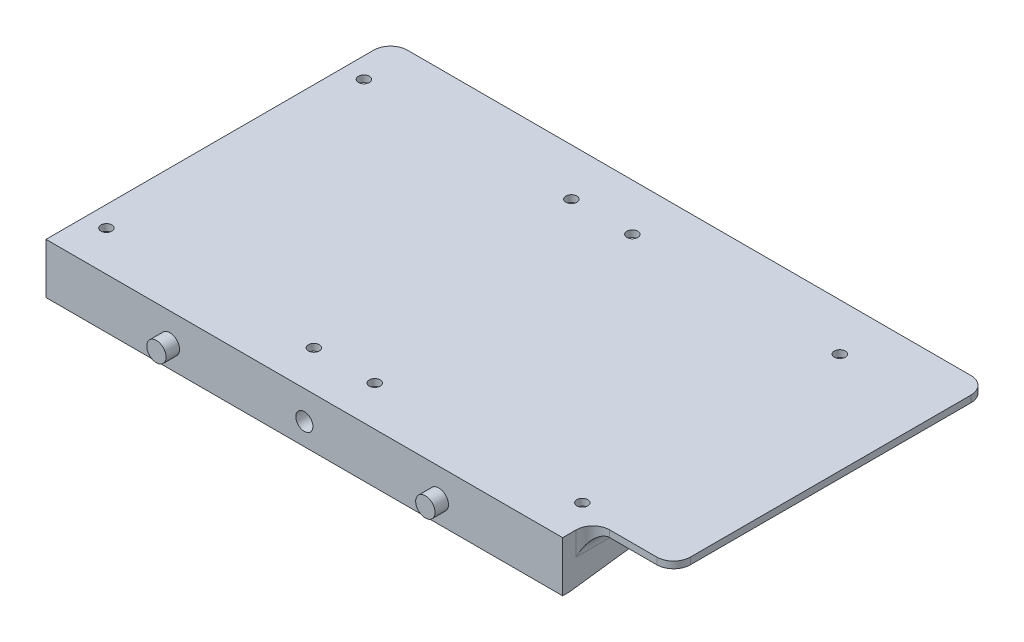
ISO-10303-21;
HEADER;
FILE_DESCRIPTION(('STEP AP214'),'2;1');
FILE_NAME('part.step','',(''),(''),'','','');
FILE_SCHEMA(('AUTOMOTIVE_DESIGN { 1 0 10303 214 1 1 1 1 }'));
ENDSEC;
DATA;
#1=APPLICATION_CONTEXT('core data for automotive mechanical design processes');
#2=APPLICATION_PROTOCOL_DEFINITION('international standard','automotive_design',2000,#1);
#3=PRODUCT_CONTEXT('',#1,'mechanical');
#4=PRODUCT('Part','Part','',(#3));
#5=PRODUCT_RELATED_PRODUCT_CATEGORY('part','',(#4));
#6=PRODUCT_DEFINITION_FORMATION('','',#4);
#7=PRODUCT_DEFINITION_CONTEXT('part definition',#1,'design');
#8=PRODUCT_DEFINITION('design','',#6,#7);
#9=PRODUCT_DEFINITION_SHAPE('','',#8);
#10=(LENGTH_UNIT() NAMED_UNIT(*) SI_UNIT(.MILLI.,.METRE.));
#11=(NAMED_UNIT(*) PLANE_ANGLE_UNIT() SI_UNIT($,.RADIAN.));
#12=(NAMED_UNIT(*) SI_UNIT($,.STERADIAN.) SOLID_ANGLE_UNIT());
#13=UNCERTAINTY_MEASURE_WITH_UNIT(LENGTH_MEASURE(1.E-05),#10,'distance_accuracy_value','');
#14=(GEOMETRIC_REPRESENTATION_CONTEXT(3) GLOBAL_UNCERTAINTY_ASSIGNED_CONTEXT((#13)) GLOBAL_UNIT_ASSIGNED_CONTEXT((#10,
#11,#12)) REPRESENTATION_CONTEXT('',''));
#15=CARTESIAN_POINT('',(0.,0.,0.));
#16=DIRECTION('',(0.,0.,1.));
#17=DIRECTION('',(1.,0.,0.));
#18=AXIS2_PLACEMENT_3D('',#15,#16,#17);
#19=CARTESIAN_POINT('',(151.7,0.,0.));
#20=DIRECTION('',(1.,0.,0.));
#21=DIRECTION('',(0.,0.,-1.));
#22=AXIS2_PLACEMENT_3D('',#19,#20,#21);
#23=PLANE('',#22);
#24=DIRECTION('',(0.,0.128284441850094,-0.991737415841113));
#25=VECTOR('',#24,1.);
#26=CARTESIAN_POINT('',(151.7,0.,-100.5));
#27=LINE('',#26,#25);
#28=CARTESIAN_POINT('',(151.7,-13.,0.));
#29=VERTEX_POINT('',#28);
#30=CARTESIAN_POINT('',(151.7,-5.,-61.8461538461539));
#31=VERTEX_POINT('',#30);
#32=EDGE_CURVE('E320',#29,#31,#27,.T.);
#33=ORIENTED_EDGE('',*,*,#32,.T.);
#34=DIRECTION('',(0.,0.,1.));
#35=VECTOR('',#34,1.);
#36=CARTESIAN_POINT('',(151.7,-5.,0.));
#37=LINE('',#36,#35);
#38=CARTESIAN_POINT('',(151.7,-5.,-1.99999999999999));
#39=VERTEX_POINT('',#38);
#40=EDGE_CURVE('E292',#31,#39,#37,.T.);
#41=ORIENTED_EDGE('',*,*,#40,.T.);
#42=DIRECTION('',(0.,1.,0.));
#43=VECTOR('',#42,1.);
#44=CARTESIAN_POINT('',(151.7,2.,-1.99999999999999));
#45=LINE('',#44,#43);
#46=CARTESIAN_POINT('',(151.7,2.,-1.99999999999999));
#47=VERTEX_POINT('',#46);
#48=EDGE_CURVE('E59',#39,#47,#45,.T.);
#49=ORIENTED_EDGE('',*,*,#48,.T.);
#50=DIRECTION('',(0.,0.,1.));
#51=VECTOR('',#50,1.);
#52=CARTESIAN_POINT('',(151.7,2.,0.));
#53=LINE('',#52,#51);
#54=CARTESIAN_POINT('',(151.7,2.,2.));
#55=VERTEX_POINT('',#54);
#56=EDGE_CURVE('E325',#47,#55,#53,.T.);
#57=ORIENTED_EDGE('',*,*,#56,.T.);
#58=DIRECTION('',(0.,-1.,0.));
#59=VECTOR('',#58,1.);
#60=CARTESIAN_POINT('',(151.7,0.,2.));
#61=LINE('',#60,#59);
#62=CARTESIAN_POINT('',(151.7,-13.,2.));
#63=VERTEX_POINT('',#62);
#64=EDGE_CURVE('E172',#55,#63,#61,.T.);
#65=ORIENTED_EDGE('',*,*,#64,.T.);
#66=DIRECTION('',(0.,0.,1.));
#67=VECTOR('',#66,1.);
#68=CARTESIAN_POINT('',(151.7,-13.,2.));
#69=LINE('',#68,#67);
#70=EDGE_CURVE('E324',#29,#63,#69,.T.);
#71=ORIENTED_EDGE('',*,*,#70,.F.);
#72=EDGE_LOOP('',(#33,#41,#49,#57,#65,#71));
#73=FACE_BOUND('',#72,.T.);
#74=ADVANCED_FACE('F37',(#73),#23,.T.);
#75=CARTESIAN_POINT('',(0.,0.,0.));
#76=DIRECTION('',(0.,0.,1.));
#77=DIRECTION('',(1.,0.,0.));
#78=AXIS2_PLACEMENT_3D('',#75,#76,#77);
#79=PLANE('',#78);
#80=DIRECTION('',(0.,-1.,0.));
#81=VECTOR('',#80,1.);
#82=CARTESIAN_POINT('',(149.7,-13.,0.));
#83=LINE('',#82,#81);
#84=CARTESIAN_POINT('',(149.7,0.,0.));
#85=VERTEX_POINT('',#84);
#86=CARTESIAN_POINT('',(149.7,-13.,0.));
#87=VERTEX_POINT('',#86);
#88=EDGE_CURVE('E252',#85,#87,#83,.T.);
#89=ORIENTED_EDGE('',*,*,#88,.T.);
#90=DIRECTION('',(1.,0.,0.));
#91=VECTOR('',#90,1.);
#92=CARTESIAN_POINT('',(0.,-13.,0.));
#93=LINE('',#92,#91);
#94=CARTESIAN_POINT('',(0.,-13.,0.));
#95=VERTEX_POINT('',#94);
#96=EDGE_CURVE('E178',#95,#87,#93,.T.);
#97=ORIENTED_EDGE('',*,*,#96,.F.);
#98=DIRECTION('',(0.,1.,0.));
#99=VECTOR('',#98,1.);
#100=CARTESIAN_POINT('',(0.,0.,0.));
#101=LINE('',#100,#99);
#102=CARTESIAN_POINT('',(0.,0.,0.));
#103=VERTEX_POINT('',#102);
#104=EDGE_CURVE('E338',#95,#103,#101,.T.);
#105=ORIENTED_EDGE('',*,*,#104,.T.);
#106=DIRECTION('',(1.,0.,0.));
#107=VECTOR('',#106,1.);
#108=CARTESIAN_POINT('',(0.,0.,0.));
#109=LINE('',#108,#107);
#110=EDGE_CURVE('E232',#103,#85,#109,.T.);
#111=ORIENTED_EDGE('',*,*,#110,.T.);
#112=EDGE_LOOP('',(#89,#97,#105,#111));
#113=FACE_BOUND('',#112,.T.);
#114=CARTESIAN_POINT('',(74.85,-6.5,0.));
#115=DIRECTION('',(0.,0.,1.));
#116=DIRECTION('',(1.,0.,0.));
#117=AXIS2_PLACEMENT_3D('',#114,#115,#116);
#118=CIRCLE('',#117,4.00000000000001);
#119=CARTESIAN_POINT('',(78.85,-6.5,0.));
#120=VERTEX_POINT('',#119);
#121=EDGE_CURVE('E215',#120,#120,#118,.F.);
#122=ORIENTED_EDGE('',*,*,#121,.F.);
#123=EDGE_LOOP('',(#122));
#124=FACE_BOUND('',#123,.T.);
#125=ADVANCED_FACE('F344',(#113,#124),#79,.F.);
#126=CARTESIAN_POINT('',(0.,2.,-100.5));
#127=DIRECTION('',(0.,0.,-1.));
#128=DIRECTION('',(-1.,0.,0.));
#129=AXIS2_PLACEMENT_3D('',#126,#127,#128);
#130=PLANE('',#129);
#131=DIRECTION('',(1.,0.,0.));
#132=VECTOR('',#131,1.);
#133=CARTESIAN_POINT('',(0.,0.,-100.5));
#134=LINE('',#133,#132);
#135=CARTESIAN_POINT('',(3.,0.,-100.5));
#136=VERTEX_POINT('',#135);
#137=CARTESIAN_POINT('',(149.7,0.,-100.5));
#138=VERTEX_POINT('',#137);
#139=EDGE_CURVE('E227',#136,#138,#134,.T.);
#140=ORIENTED_EDGE('',*,*,#139,.F.);
#141=DIRECTION('',(0.,-1.,0.));
#142=VECTOR('',#141,1.);
#143=CARTESIAN_POINT('',(3.,2.,-100.5));
#144=LINE('',#143,#142);
#145=CARTESIAN_POINT('',(3.,2.,-100.5));
#146=VERTEX_POINT('',#145);
#147=EDGE_CURVE('E288',#136,#146,#144,.F.);
#148=ORIENTED_EDGE('',*,*,#147,.T.);
#149=DIRECTION('',(1.,0.,0.));
#150=VECTOR('',#149,1.);
#151=CARTESIAN_POINT('',(0.,2.,-100.5));
#152=LINE('',#151,#150);
#153=CARTESIAN_POINT('',(170.7,2.,-100.5));
#154=VERTEX_POINT('',#153);
#155=EDGE_CURVE('E200',#146,#154,#152,.T.);
#156=ORIENTED_EDGE('',*,*,#155,.T.);
#157=DIRECTION('',(0.,1.,0.));
#158=VECTOR('',#157,1.);
#159=CARTESIAN_POINT('',(170.7,2.,-100.5));
#160=LINE('',#159,#158);
#161=CARTESIAN_POINT('',(170.7,0.,-100.5));
#162=VERTEX_POINT('',#161);
#163=EDGE_CURVE('E285',#154,#162,#160,.F.);
#164=ORIENTED_EDGE('',*,*,#163,.T.);
#165=DIRECTION('',(1.,0.,0.));
#166=VECTOR('',#165,1.);
#167=CARTESIAN_POINT('',(0.,0.,-100.5));
#168=LINE('',#167,#166);
#169=CARTESIAN_POINT('',(156.7,0.,-100.5));
#170=VERTEX_POINT('',#169);
#171=EDGE_CURVE('E362',#170,#162,#168,.T.);
#172=ORIENTED_EDGE('',*,*,#171,.F.);
#173=DIRECTION('',(-1.,0.,0.));
#174=VECTOR('',#173,1.);
#175=CARTESIAN_POINT('',(151.7,0.,-100.5));
#176=LINE('',#175,#174);
#177=EDGE_CURVE('E51',#170,#138,#176,.T.);
#178=ORIENTED_EDGE('',*,*,#177,.T.);
#179=EDGE_LOOP('',(#140,#148,#156,#164,#172,#178));
#180=FACE_BOUND('',#179,.T.);
#181=ADVANCED_FACE('F361',(#180),#130,.T.);
#182=CARTESIAN_POINT('',(83.92,2.,-9.90000000000002));
#183=DIRECTION('',(0.,-1.,0.));
#184=DIRECTION('',(0.,0.,-1.));
#185=AXIS2_PLACEMENT_3D('',#182,#183,#184);
#186=CYLINDRICAL_SURFACE('',#185,1.62499999999999);
#187=CARTESIAN_POINT('',(83.92,2.,-9.90000000000002));
#188=DIRECTION('',(0.,1.,0.));
#189=DIRECTION('',(0.,0.,1.));
#190=AXIS2_PLACEMENT_3D('',#187,#188,#189);
#191=CIRCLE('',#190,1.62499999999999);
#192=CARTESIAN_POINT('',(83.92,2.,-8.27500000000003));
#193=VERTEX_POINT('',#192);
#194=EDGE_CURVE('E209',#193,#193,#191,.T.);
#195=ORIENTED_EDGE('',*,*,#194,.T.);
#196=EDGE_LOOP('',(#195));
#197=FACE_BOUND('',#196,.T.);
#198=CARTESIAN_POINT('',(83.92,0.,-9.90000000000002));
#199=DIRECTION('',(0.,1.,0.));
#200=DIRECTION('',(0.,0.,1.));
#201=AXIS2_PLACEMENT_3D('',#198,#199,#200);
#202=CIRCLE('',#201,1.62499999999999);
#203=CARTESIAN_POINT('',(83.92,0.,-8.27500000000003));
#204=VERTEX_POINT('',#203);
#205=EDGE_CURVE('E244',#204,#204,#202,.T.);
#206=ORIENTED_EDGE('',*,*,#205,.F.);
#207=EDGE_LOOP('',(#206));
#208=FACE_BOUND('',#207,.T.);
#209=ADVANCED_FACE('F405',(#197,#208),#186,.F.);
#210=CARTESIAN_POINT('',(83.92,2.,-86.5));
#211=DIRECTION('',(0.,-1.,0.));
#212=DIRECTION('',(0.,0.,-1.));
#213=AXIS2_PLACEMENT_3D('',#210,#211,#212);
#214=CYLINDRICAL_SURFACE('',#213,1.62499999999999);
#215=CARTESIAN_POINT('',(83.92,2.,-86.5));
#216=DIRECTION('',(0.,1.,0.));
#217=DIRECTION('',(0.,0.,1.));
#218=AXIS2_PLACEMENT_3D('',#215,#216,#217);
#219=CIRCLE('',#218,1.62499999999999);
#220=CARTESIAN_POINT('',(83.92,2.,-84.875));
#221=VERTEX_POINT('',#220);
#222=EDGE_CURVE('E206',#221,#221,#219,.T.);
#223=ORIENTED_EDGE('',*,*,#222,.T.);
#224=EDGE_LOOP('',(#223));
#225=FACE_BOUND('',#224,.T.);
#226=CARTESIAN_POINT('',(83.92,0.,-86.5));
#227=DIRECTION('',(0.,1.,0.));
#228=DIRECTION('',(0.,0.,1.));
#229=AXIS2_PLACEMENT_3D('',#226,#227,#228);
#230=CIRCLE('',#229,1.62499999999999);
#231=CARTESIAN_POINT('',(83.92,0.,-84.875));
#232=VERTEX_POINT('',#231);
#233=EDGE_CURVE('E241',#232,#232,#230,.T.);
#234=ORIENTED_EDGE('',*,*,#233,.F.);
#235=EDGE_LOOP('',(#234));
#236=FACE_BOUND('',#235,.T.);
#237=ADVANCED_FACE('F427',(#225,#236),#214,.F.);
#238=CARTESIAN_POINT('',(145.64,2.,-86.5));
#239=DIRECTION('',(0.,-1.,0.));
#240=DIRECTION('',(0.,0.,-1.));
#241=AXIS2_PLACEMENT_3D('',#238,#239,#240);
#242=CYLINDRICAL_SURFACE('',#241,1.62499999999998);
#243=CARTESIAN_POINT('',(145.64,2.,-86.5));
#244=DIRECTION('',(0.,1.,0.));
#245=DIRECTION('',(0.,0.,1.));
#246=AXIS2_PLACEMENT_3D('',#243,#244,#245);
#247=CIRCLE('',#246,1.62499999999998);
#248=CARTESIAN_POINT('',(145.64,2.,-84.875));
#249=VERTEX_POINT('',#248);
#250=EDGE_CURVE('E203',#249,#249,#247,.T.);
#251=ORIENTED_EDGE('',*,*,#250,.T.);
#252=EDGE_LOOP('',(#251));
#253=FACE_BOUND('',#252,.T.);
#254=CARTESIAN_POINT('',(145.64,0.,-86.5));
#255=DIRECTION('',(0.,1.,0.));
#256=DIRECTION('',(0.,0.,1.));
#257=AXIS2_PLACEMENT_3D('',#254,#255,#256);
#258=CIRCLE('',#257,1.62499999999998);
#259=CARTESIAN_POINT('',(145.64,0.,-84.875));
#260=VERTEX_POINT('',#259);
#261=EDGE_CURVE('E238',#260,#260,#258,.T.);
#262=ORIENTED_EDGE('',*,*,#261,.F.);
#263=EDGE_LOOP('',(#262));
#264=FACE_BOUND('',#263,.T.);
#265=ADVANCED_FACE('F431',(#253,#264),#242,.F.);
#266=CARTESIAN_POINT('',(4.07,2.,-86.5));
#267=DIRECTION('',(0.,-1.,0.));
#268=DIRECTION('',(0.,0.,-1.));
#269=AXIS2_PLACEMENT_3D('',#266,#267,#268);
#270=CYLINDRICAL_SURFACE('',#269,1.625);
#271=CARTESIAN_POINT('',(4.07,2.,-86.5));
#272=DIRECTION('',(0.,1.,0.));
#273=DIRECTION('',(0.,0.,1.));
#274=AXIS2_PLACEMENT_3D('',#271,#272,#273);
#275=CIRCLE('',#274,1.625);
#276=CARTESIAN_POINT('',(4.07,2.,-84.875));
#277=VERTEX_POINT('',#276);
#278=EDGE_CURVE('E197',#277,#277,#275,.T.);
#279=ORIENTED_EDGE('',*,*,#278,.T.);
#280=EDGE_LOOP('',(#279));
#281=FACE_BOUND('',#280,.T.);
#282=CARTESIAN_POINT('',(4.07,0.,-86.5));
#283=DIRECTION('',(0.,1.,0.));
#284=DIRECTION('',(0.,0.,1.));
#285=AXIS2_PLACEMENT_3D('',#282,#283,#284);
#286=CIRCLE('',#285,1.625);
#287=CARTESIAN_POINT('',(4.07,0.,-84.875));
#288=VERTEX_POINT('',#287);
#289=EDGE_CURVE('E224',#288,#288,#286,.T.);
#290=ORIENTED_EDGE('',*,*,#289,.F.);
#291=EDGE_LOOP('',(#290));
#292=FACE_BOUND('',#291,.T.);
#293=ADVANCED_FACE('F434',(#281,#292),#270,.F.);
#294=CARTESIAN_POINT('',(65.79,2.,-86.5));
#295=DIRECTION('',(0.,-1.,0.));
#296=DIRECTION('',(0.,0.,-1.));
#297=AXIS2_PLACEMENT_3D('',#294,#295,#296);
#298=CYLINDRICAL_SURFACE('',#297,1.62499999999999);
#299=CARTESIAN_POINT('',(65.79,2.,-86.5));
#300=DIRECTION('',(0.,1.,0.));
#301=DIRECTION('',(0.,0.,1.));
#302=AXIS2_PLACEMENT_3D('',#299,#300,#301);
#303=CIRCLE('',#302,1.62499999999999);
#304=CARTESIAN_POINT('',(65.79,2.,-84.875));
#305=VERTEX_POINT('',#304);
#306=EDGE_CURVE('E194',#305,#305,#303,.T.);
#307=ORIENTED_EDGE('',*,*,#306,.T.);
#308=EDGE_LOOP('',(#307));
#309=FACE_BOUND('',#308,.T.);
#310=CARTESIAN_POINT('',(65.79,0.,-86.5));
#311=DIRECTION('',(0.,1.,0.));
#312=DIRECTION('',(0.,0.,1.));
#313=AXIS2_PLACEMENT_3D('',#310,#311,#312);
#314=CIRCLE('',#313,1.62499999999999);
#315=CARTESIAN_POINT('',(65.79,0.,-84.875));
#316=VERTEX_POINT('',#315);
#317=EDGE_CURVE('E221',#316,#316,#314,.T.);
#318=ORIENTED_EDGE('',*,*,#317,.F.);
#319=EDGE_LOOP('',(#318));
#320=FACE_BOUND('',#319,.T.);
#321=ADVANCED_FACE('F439',(#309,#320),#298,.F.);
#322=CARTESIAN_POINT('',(4.07,2.,-9.90000000000002));
#323=DIRECTION('',(0.,-1.,0.));
#324=DIRECTION('',(0.,0.,-1.));
#325=AXIS2_PLACEMENT_3D('',#322,#323,#324);
#326=CYLINDRICAL_SURFACE('',#325,1.625);
#327=CARTESIAN_POINT('',(4.07,2.,-9.90000000000002));
#328=DIRECTION('',(0.,1.,0.));
#329=DIRECTION('',(0.,0.,1.));
#330=AXIS2_PLACEMENT_3D('',#327,#328,#329);
#331=CIRCLE('',#330,1.625);
#332=CARTESIAN_POINT('',(4.07,2.,-8.27500000000002));
#333=VERTEX_POINT('',#332);
#334=EDGE_CURVE('E190',#333,#333,#331,.T.);
#335=ORIENTED_EDGE('',*,*,#334,.T.);
#336=EDGE_LOOP('',(#335));
#337=FACE_BOUND('',#336,.T.);
#338=CARTESIAN_POINT('',(4.07,0.,-9.90000000000002));
#339=DIRECTION('',(0.,1.,0.));
#340=DIRECTION('',(0.,0.,1.));
#341=AXIS2_PLACEMENT_3D('',#338,#339,#340);
#342=CIRCLE('',#341,1.625);
#343=CARTESIAN_POINT('',(4.07,0.,-8.27500000000002));
#344=VERTEX_POINT('',#343);
#345=EDGE_CURVE('E218',#344,#344,#342,.T.);
#346=ORIENTED_EDGE('',*,*,#345,.F.);
#347=EDGE_LOOP('',(#346));
#348=FACE_BOUND('',#347,.T.);
#349=ADVANCED_FACE('F443',(#337,#348),#326,.F.);
#350=CARTESIAN_POINT('',(65.79,2.,-9.90000000000002));
#351=DIRECTION('',(0.,-1.,0.));
#352=DIRECTION('',(0.,0.,-1.));
#353=AXIS2_PLACEMENT_3D('',#350,#351,#352);
#354=CYLINDRICAL_SURFACE('',#353,1.625);
#355=CARTESIAN_POINT('',(65.79,2.,-9.90000000000002));
#356=DIRECTION('',(0.,1.,0.));
#357=DIRECTION('',(0.,0.,1.));
#358=AXIS2_PLACEMENT_3D('',#355,#356,#357);
#359=CIRCLE('',#358,1.625);
#360=CARTESIAN_POINT('',(65.79,2.,-8.27500000000002));
#361=VERTEX_POINT('',#360);
#362=EDGE_CURVE('E187',#361,#361,#359,.T.);
#363=ORIENTED_EDGE('',*,*,#362,.T.);
#364=EDGE_LOOP('',(#363));
#365=FACE_BOUND('',#364,.T.);
#366=CARTESIAN_POINT('',(65.79,0.,-9.90000000000002));
#367=DIRECTION('',(0.,1.,0.));
#368=DIRECTION('',(0.,0.,1.));
#369=AXIS2_PLACEMENT_3D('',#366,#367,#368);
#370=CIRCLE('',#369,1.625);
#371=CARTESIAN_POINT('',(65.79,0.,-8.27500000000002));
#372=VERTEX_POINT('',#371);
#373=EDGE_CURVE('E180',#372,#372,#370,.T.);
#374=ORIENTED_EDGE('',*,*,#373,.F.);
#375=EDGE_LOOP('',(#374));
#376=FACE_BOUND('',#375,.T.);
#377=ADVANCED_FACE('F423',(#365,#376),#354,.F.);
#378=CARTESIAN_POINT('',(145.64,2.,-9.90000000000002));
#379=DIRECTION('',(0.,-1.,0.));
#380=DIRECTION('',(0.,0.,-1.));
#381=AXIS2_PLACEMENT_3D('',#378,#379,#380);
#382=CYLINDRICAL_SURFACE('',#381,1.625);
#383=CARTESIAN_POINT('',(145.64,2.,-9.90000000000002));
#384=DIRECTION('',(0.,1.,0.));
#385=DIRECTION('',(0.,0.,1.));
#386=AXIS2_PLACEMENT_3D('',#383,#384,#385);
#387=CIRCLE('',#386,1.625);
#388=CARTESIAN_POINT('',(145.64,2.,-8.27500000000002));
#389=VERTEX_POINT('',#388);
#390=EDGE_CURVE('E212',#389,#389,#387,.T.);
#391=ORIENTED_EDGE('',*,*,#390,.T.);
#392=EDGE_LOOP('',(#391));
#393=FACE_BOUND('',#392,.T.);
#394=CARTESIAN_POINT('',(145.64,0.,-9.90000000000002));
#395=DIRECTION('',(0.,1.,0.));
#396=DIRECTION('',(0.,0.,1.));
#397=AXIS2_PLACEMENT_3D('',#394,#395,#396);
#398=CIRCLE('',#397,1.625);
#399=CARTESIAN_POINT('',(145.64,0.,-8.27500000000002));
#400=VERTEX_POINT('',#399);
#401=EDGE_CURVE('E191',#400,#400,#398,.T.);
#402=ORIENTED_EDGE('',*,*,#401,.F.);
#403=EDGE_LOOP('',(#402));
#404=FACE_BOUND('',#403,.T.);
#405=ADVANCED_FACE('F417',(#393,#404),#382,.F.);
#406=CARTESIAN_POINT('',(0.,2.,0.));
#407=DIRECTION('',(0.,1.,0.));
#408=DIRECTION('',(0.,0.,1.));
#409=AXIS2_PLACEMENT_3D('',#406,#407,#408);
#410=PLANE('',#409);
#411=DIRECTION('',(1.,0.,0.));
#412=VECTOR('',#411,1.);
#413=CARTESIAN_POINT('',(0.,2.,-6.99999999999999));
#414=LINE('',#413,#412);
#415=CARTESIAN_POINT('',(156.7,2.,-6.99999999999999));
#416=VERTEX_POINT('',#415);
#417=CARTESIAN_POINT('',(170.7,2.,-6.99999999999999));
#418=VERTEX_POINT('',#417);
#419=EDGE_CURVE('E308',#416,#418,#414,.T.);
#420=ORIENTED_EDGE('',*,*,#419,.T.);
#421=CARTESIAN_POINT('',(170.7,2.,-12.));
#422=DIRECTION('',(0.,1.,0.));
#423=DIRECTION('',(0.,0.,1.));
#424=AXIS2_PLACEMENT_3D('',#421,#422,#423);
#425=CIRCLE('',#424,5.);
#426=CARTESIAN_POINT('',(175.7,2.,-12.));
#427=VERTEX_POINT('',#426);
#428=EDGE_CURVE('E266',#418,#427,#425,.T.);
#429=ORIENTED_EDGE('',*,*,#428,.T.);
#430=DIRECTION('',(0.,0.,-1.));
#431=VECTOR('',#430,1.);
#432=CARTESIAN_POINT('',(175.7,2.,0.));
#433=LINE('',#432,#431);
#434=CARTESIAN_POINT('',(175.7,2.,-95.5));
#435=VERTEX_POINT('',#434);
#436=EDGE_CURVE('E471',#427,#435,#433,.T.);
#437=ORIENTED_EDGE('',*,*,#436,.T.);
#438=CARTESIAN_POINT('',(170.7,2.,-95.5));
#439=DIRECTION('',(0.,1.,0.));
#440=DIRECTION('',(0.,0.,1.));
#441=AXIS2_PLACEMENT_3D('',#438,#439,#440);
#442=CIRCLE('',#441,5.);
#443=EDGE_CURVE('E263',#435,#154,#442,.T.);
#444=ORIENTED_EDGE('',*,*,#443,.T.);
#445=ORIENTED_EDGE('',*,*,#155,.F.);
#446=CARTESIAN_POINT('',(3.,2.,-95.5));
#447=DIRECTION('',(0.,1.,0.));
#448=DIRECTION('',(0.,0.,1.));
#449=AXIS2_PLACEMENT_3D('',#446,#447,#448);
#450=CIRCLE('',#449,5.);
#451=CARTESIAN_POINT('',(-2.,2.,-95.5));
#452=VERTEX_POINT('',#451);
#453=EDGE_CURVE('E157',#146,#452,#450,.T.);
#454=ORIENTED_EDGE('',*,*,#453,.T.);
#455=DIRECTION('',(0.,0.,-1.));
#456=VECTOR('',#455,1.);
#457=CARTESIAN_POINT('',(-2.,2.,0.));
#458=LINE('',#457,#456);
#459=CARTESIAN_POINT('',(-2.,2.,2.));
#460=VERTEX_POINT('',#459);
#461=EDGE_CURVE('E147',#460,#452,#458,.T.);
#462=ORIENTED_EDGE('',*,*,#461,.F.);
#463=DIRECTION('',(1.,0.,0.));
#464=VECTOR('',#463,1.);
#465=CARTESIAN_POINT('',(0.,2.,2.));
#466=LINE('',#465,#464);
#467=EDGE_CURVE('E154',#460,#55,#466,.T.);
#468=ORIENTED_EDGE('',*,*,#467,.T.);
#469=ORIENTED_EDGE('',*,*,#56,.F.);
#470=CARTESIAN_POINT('',(156.7,2.,-1.99999999999999));
#471=DIRECTION('',(0.,1.,0.));
#472=DIRECTION('',(0.,0.,1.));
#473=AXIS2_PLACEMENT_3D('',#470,#471,#472);
#474=CIRCLE('',#473,5.);
#475=EDGE_CURVE('E290',#47,#416,#474,.F.);
#476=ORIENTED_EDGE('',*,*,#475,.T.);
#477=EDGE_LOOP('',(#420,#429,#437,#444,#445,#454,#462,#468,#469,#476));
#478=FACE_BOUND('',#477,.T.);
#479=ORIENTED_EDGE('',*,*,#362,.F.);
#480=EDGE_LOOP('',(#479));
#481=FACE_BOUND('',#480,.T.);
#482=ORIENTED_EDGE('',*,*,#334,.F.);
#483=EDGE_LOOP('',(#482));
#484=FACE_BOUND('',#483,.T.);
#485=ORIENTED_EDGE('',*,*,#306,.F.);
#486=EDGE_LOOP('',(#485));
#487=FACE_BOUND('',#486,.T.);
#488=ORIENTED_EDGE('',*,*,#278,.F.);
#489=EDGE_LOOP('',(#488));
#490=FACE_BOUND('',#489,.T.);
#491=ORIENTED_EDGE('',*,*,#250,.F.);
#492=EDGE_LOOP('',(#491));
#493=FACE_BOUND('',#492,.T.);
#494=ORIENTED_EDGE('',*,*,#222,.F.);
#495=EDGE_LOOP('',(#494));
#496=FACE_BOUND('',#495,.T.);
#497=ORIENTED_EDGE('',*,*,#194,.F.);
#498=EDGE_LOOP('',(#497));
#499=FACE_BOUND('',#498,.T.);
#500=ORIENTED_EDGE('',*,*,#390,.F.);
#501=EDGE_LOOP('',(#500));
#502=FACE_BOUND('',#501,.T.);
#503=ADVANCED_FACE('F150',(#478,#481,#484,#487,#490,#493,#496,#499,#502),#410,.T.);
#504=CARTESIAN_POINT('',(0.,0.,0.));
#505=DIRECTION('',(0.,1.,0.));
#506=DIRECTION('',(0.,0.,1.));
#507=AXIS2_PLACEMENT_3D('',#504,#505,#506);
#508=PLANE('',#507);
#509=ORIENTED_EDGE('',*,*,#373,.T.);
#510=EDGE_LOOP('',(#509));
#511=FACE_BOUND('',#510,.T.);
#512=ORIENTED_EDGE('',*,*,#345,.T.);
#513=EDGE_LOOP('',(#512));
#514=FACE_BOUND('',#513,.T.);
#515=ORIENTED_EDGE('',*,*,#317,.T.);
#516=EDGE_LOOP('',(#515));
#517=FACE_BOUND('',#516,.T.);
#518=ORIENTED_EDGE('',*,*,#289,.T.);
#519=EDGE_LOOP('',(#518));
#520=FACE_BOUND('',#519,.T.);
#521=DIRECTION('',(0.,0.,-1.));
#522=VECTOR('',#521,1.);
#523=CARTESIAN_POINT('',(0.,0.,0.));
#524=LINE('',#523,#522);
#525=CARTESIAN_POINT('',(0.,0.,-99.5));
#526=VERTEX_POINT('',#525);
#527=EDGE_CURVE('E229',#103,#526,#524,.T.);
#528=ORIENTED_EDGE('',*,*,#527,.T.);
#529=CARTESIAN_POINT('',(3.,0.,-95.5));
#530=DIRECTION('',(0.,1.,0.));
#531=DIRECTION('',(0.,0.,1.));
#532=AXIS2_PLACEMENT_3D('',#529,#530,#531);
#533=CIRCLE('',#532,5.);
#534=EDGE_CURVE('E283',#526,#136,#533,.F.);
#535=ORIENTED_EDGE('',*,*,#534,.T.);
#536=ORIENTED_EDGE('',*,*,#139,.T.);
#537=DIRECTION('',(0.,0.,-1.));
#538=VECTOR('',#537,1.);
#539=CARTESIAN_POINT('',(149.7,0.,0.));
#540=LINE('',#539,#538);
#541=EDGE_CURVE('E235',#85,#138,#540,.T.);
#542=ORIENTED_EDGE('',*,*,#541,.F.);
#543=ORIENTED_EDGE('',*,*,#110,.F.);
#544=EDGE_LOOP('',(#528,#535,#536,#542,#543));
#545=FACE_BOUND('',#544,.T.);
#546=ORIENTED_EDGE('',*,*,#261,.T.);
#547=EDGE_LOOP('',(#546));
#548=FACE_BOUND('',#547,.T.);
#549=ORIENTED_EDGE('',*,*,#233,.T.);
#550=EDGE_LOOP('',(#549));
#551=FACE_BOUND('',#550,.T.);
#552=ORIENTED_EDGE('',*,*,#205,.T.);
#553=EDGE_LOOP('',(#552));
#554=FACE_BOUND('',#553,.T.);
#555=ORIENTED_EDGE('',*,*,#401,.T.);
#556=EDGE_LOOP('',(#555));
#557=FACE_BOUND('',#556,.T.);
#558=ADVANCED_FACE('F351',(#511,#514,#517,#520,#545,#548,#551,#554,#557),#508,.F.);
#559=CARTESIAN_POINT('',(0.,-13.,2.));
#560=DIRECTION('',(0.,1.,0.));
#561=DIRECTION('',(0.,0.,1.));
#562=AXIS2_PLACEMENT_3D('',#559,#560,#561);
#563=PLANE('',#562);
#564=DIRECTION('',(-1.,0.,0.));
#565=VECTOR('',#564,1.);
#566=CARTESIAN_POINT('',(151.7,-13.,0.));
#567=LINE('',#566,#565);
#568=EDGE_CURVE('E327',#29,#87,#567,.T.);
#569=ORIENTED_EDGE('',*,*,#568,.F.);
#570=ORIENTED_EDGE('',*,*,#70,.T.);
#571=DIRECTION('',(1.,0.,0.));
#572=VECTOR('',#571,1.);
#573=CARTESIAN_POINT('',(0.,-13.,2.));
#574=LINE('',#573,#572);
#575=CARTESIAN_POINT('',(-2.,-13.,2.));
#576=VERTEX_POINT('',#575);
#577=EDGE_CURVE('E177',#576,#63,#574,.T.);
#578=ORIENTED_EDGE('',*,*,#577,.F.);
#579=DIRECTION('',(0.,0.,-1.));
#580=VECTOR('',#579,1.);
#581=CARTESIAN_POINT('',(-2.,-13.,2.));
#582=LINE('',#581,#580);
#583=CARTESIAN_POINT('',(-2.,-13.,0.));
#584=VERTEX_POINT('',#583);
#585=EDGE_CURVE('E168',#576,#584,#582,.T.);
#586=ORIENTED_EDGE('',*,*,#585,.T.);
#587=DIRECTION('',(1.,0.,0.));
#588=VECTOR('',#587,1.);
#589=CARTESIAN_POINT('',(-2.,-13.,0.));
#590=LINE('',#589,#588);
#591=EDGE_CURVE('E161',#584,#95,#590,.T.);
#592=ORIENTED_EDGE('',*,*,#591,.T.);
#593=ORIENTED_EDGE('',*,*,#96,.T.);
#594=EDGE_LOOP('',(#569,#570,#578,#586,#592,#593));
#595=FACE_BOUND('',#594,.T.);
#596=ADVANCED_FACE('F411',(#595),#563,.F.);
#597=CARTESIAN_POINT('',(0.,0.,2.));
#598=DIRECTION('',(0.,0.,1.));
#599=DIRECTION('',(1.,0.,0.));
#600=AXIS2_PLACEMENT_3D('',#597,#598,#599);
#601=PLANE('',#600);
#602=ORIENTED_EDGE('',*,*,#64,.F.);
#603=ORIENTED_EDGE('',*,*,#467,.F.);
#604=DIRECTION('',(0.,1.,0.));
#605=VECTOR('',#604,1.);
#606=CARTESIAN_POINT('',(-2.,0.,2.));
#607=LINE('',#606,#605);
#608=EDGE_CURVE('E165',#576,#460,#607,.T.);
#609=ORIENTED_EDGE('',*,*,#608,.F.);
#610=ORIENTED_EDGE('',*,*,#577,.T.);
#611=EDGE_LOOP('',(#602,#603,#609,#610));
#612=FACE_BOUND('',#611,.T.);
#613=CARTESIAN_POINT('',(34.85,-6.5,2.));
#614=DIRECTION('',(0.,0.,1.));
#615=DIRECTION('',(1.,0.,0.));
#616=AXIS2_PLACEMENT_3D('',#613,#614,#615);
#617=CIRCLE('',#616,2.875);
#618=CARTESIAN_POINT('',(37.725,-6.5,2.));
#619=VERTEX_POINT('',#618);
#620=EDGE_CURVE('E374',#619,#619,#617,.T.);
#621=ORIENTED_EDGE('',*,*,#620,.F.);
#622=EDGE_LOOP('',(#621));
#623=FACE_BOUND('',#622,.T.);
#624=CARTESIAN_POINT('',(114.85,-6.5,2.));
#625=DIRECTION('',(0.,0.,1.));
#626=DIRECTION('',(1.,0.,0.));
#627=AXIS2_PLACEMENT_3D('',#624,#625,#626);
#628=CIRCLE('',#627,2.875);
#629=CARTESIAN_POINT('',(117.725,-6.5,2.));
#630=VERTEX_POINT('',#629);
#631=EDGE_CURVE('E377',#630,#630,#628,.T.);
#632=ORIENTED_EDGE('',*,*,#631,.F.);
#633=EDGE_LOOP('',(#632));
#634=FACE_BOUND('',#633,.T.);
#635=CARTESIAN_POINT('',(74.85,-6.5,2.));
#636=DIRECTION('',(0.,0.,1.));
#637=DIRECTION('',(1.,0.,0.));
#638=AXIS2_PLACEMENT_3D('',#635,#636,#637);
#639=CIRCLE('',#638,2.54999999999999);
#640=CARTESIAN_POINT('',(77.4,-6.5,2.));
#641=VERTEX_POINT('',#640);
#642=EDGE_CURVE('E249',#641,#641,#639,.T.);
#643=ORIENTED_EDGE('',*,*,#642,.F.);
#644=EDGE_LOOP('',(#643));
#645=FACE_BOUND('',#644,.T.);
#646=ADVANCED_FACE('F175',(#612,#623,#634,#645),#601,.T.);
#647=CARTESIAN_POINT('',(0.,0.,0.));
#648=DIRECTION('',(-1.,0.,0.));
#649=DIRECTION('',(0.,0.,1.));
#650=AXIS2_PLACEMENT_3D('',#647,#648,#649);
#651=PLANE('',#650);
#652=DIRECTION('',(0.,-0.128284441850094,0.991737415841114));
#653=VECTOR('',#652,1.);
#654=CARTESIAN_POINT('',(0.,-12.7860603257297,-1.65391825108942));
#655=LINE('',#654,#653);
#656=CARTESIAN_POINT('',(0.,-0.129353233830844,-99.5));
#657=VERTEX_POINT('',#656);
#658=EDGE_CURVE('E337',#657,#95,#655,.T.);
#659=ORIENTED_EDGE('',*,*,#658,.F.);
#660=DIRECTION('',(0.,-1.,0.));
#661=VECTOR('',#660,1.);
#662=CARTESIAN_POINT('',(0.,-0.129353233830844,-99.5));
#663=LINE('',#662,#661);
#664=EDGE_CURVE('E281',#657,#526,#663,.F.);
#665=ORIENTED_EDGE('',*,*,#664,.T.);
#666=ORIENTED_EDGE('',*,*,#527,.F.);
#667=ORIENTED_EDGE('',*,*,#104,.F.);
#668=EDGE_LOOP('',(#659,#665,#666,#667));
#669=FACE_BOUND('',#668,.T.);
#670=ADVANCED_FACE('F354',(#669),#651,.F.);
#671=CARTESIAN_POINT('',(-2.,-12.7860603257297,-1.65391825108942));
#672=DIRECTION('',(0.,0.991737415841114,0.128284441850094));
#673=DIRECTION('',(0.,-0.128284441850094,0.991737415841114));
#674=AXIS2_PLACEMENT_3D('',#671,#672,#673);
#675=PLANE('',#674);
#676=DIRECTION('',(0.,-0.128284441850094,0.991737415841114));
#677=VECTOR('',#676,1.);
#678=CARTESIAN_POINT('',(-2.,-12.7860603257297,-1.65391825108942));
#679=LINE('',#678,#677);
#680=CARTESIAN_POINT('',(-2.,-0.646766169154225,-95.5));
#681=VERTEX_POINT('',#680);
#682=EDGE_CURVE('E162',#681,#584,#679,.T.);
#683=ORIENTED_EDGE('',*,*,#682,.F.);
#684=CARTESIAN_POINT('',(3.,-0.646766169154228,-95.5));
#685=DIRECTION('',(0.,0.991737415841114,0.128284441850094));
#686=DIRECTION('',(0.,-0.128284441850094,0.991737415841114));
#687=AXIS2_PLACEMENT_3D('',#684,#685,#686);
#688=ELLIPSE('',#687,5.04165711622304,5.);
#689=EDGE_CURVE('E279',#681,#657,#688,.F.);
#690=ORIENTED_EDGE('',*,*,#689,.T.);
#691=ORIENTED_EDGE('',*,*,#658,.T.);
#692=ORIENTED_EDGE('',*,*,#591,.F.);
#693=EDGE_LOOP('',(#683,#690,#691,#692));
#694=FACE_BOUND('',#693,.T.);
#695=ADVANCED_FACE('F475',(#694),#675,.F.);
#696=CARTESIAN_POINT('',(-2.,0.,0.));
#697=DIRECTION('',(-1.,0.,0.));
#698=DIRECTION('',(0.,0.,1.));
#699=AXIS2_PLACEMENT_3D('',#696,#697,#698);
#700=PLANE('',#699);
#701=ORIENTED_EDGE('',*,*,#461,.T.);
#702=DIRECTION('',(0.,-1.,0.));
#703=VECTOR('',#702,1.);
#704=CARTESIAN_POINT('',(-2.,0.,-95.5));
#705=LINE('',#704,#703);
#706=EDGE_CURVE('E277',#452,#681,#705,.T.);
#707=ORIENTED_EDGE('',*,*,#706,.T.);
#708=ORIENTED_EDGE('',*,*,#682,.T.);
#709=ORIENTED_EDGE('',*,*,#585,.F.);
#710=ORIENTED_EDGE('',*,*,#608,.T.);
#711=EDGE_LOOP('',(#701,#707,#708,#709,#710));
#712=FACE_BOUND('',#711,.T.);
#713=ADVANCED_FACE('F166',(#712),#700,.T.);
#714=CARTESIAN_POINT('',(149.7,0.,0.));
#715=DIRECTION('',(1.,0.,0.));
#716=DIRECTION('',(0.,0.,-1.));
#717=AXIS2_PLACEMENT_3D('',#714,#715,#716);
#718=PLANE('',#717);
#719=ORIENTED_EDGE('',*,*,#88,.F.);
#720=ORIENTED_EDGE('',*,*,#541,.T.);
#721=DIRECTION('',(0.,0.128284441850094,-0.991737415841113));
#722=VECTOR('',#721,1.);
#723=CARTESIAN_POINT('',(149.7,0.,-100.5));
#724=LINE('',#723,#722);
#725=EDGE_CURVE('E329',#87,#138,#724,.T.);
#726=ORIENTED_EDGE('',*,*,#725,.F.);
#727=EDGE_LOOP('',(#719,#720,#726));
#728=FACE_BOUND('',#727,.T.);
#729=ADVANCED_FACE('F479',(#728),#718,.F.);
#730=CARTESIAN_POINT('',(151.7,0.,-100.5));
#731=DIRECTION('',(0.,0.991737415841114,0.128284441850094));
#732=DIRECTION('',(0.,-0.128284441850094,0.991737415841114));
#733=AXIS2_PLACEMENT_3D('',#730,#731,#732);
#734=PLANE('',#733);
#735=ORIENTED_EDGE('',*,*,#725,.T.);
#736=ORIENTED_EDGE('',*,*,#177,.F.);
#737=CARTESIAN_POINT('',(156.7,-5.,-61.8461538461538));
#738=DIRECTION('',(0.,0.991737415841114,0.128284441850094));
#739=DIRECTION('',(0.,-0.128284441850094,0.991737415841114));
#740=AXIS2_PLACEMENT_3D('',#737,#738,#739);
#741=ELLIPSE('',#740,38.9758877061858,5.);
#742=EDGE_CURVE('E11',#170,#31,#741,.T.);
#743=ORIENTED_EDGE('',*,*,#742,.T.);
#744=ORIENTED_EDGE('',*,*,#32,.F.);
#745=ORIENTED_EDGE('',*,*,#568,.T.);
#746=EDGE_LOOP('',(#735,#736,#743,#744,#745));
#747=FACE_BOUND('',#746,.T.);
#748=ADVANCED_FACE('F319',(#747),#734,.F.);
#749=CARTESIAN_POINT('',(74.85,-6.5,10.));
#750=DIRECTION('',(0.,0.,-1.));
#751=DIRECTION('',(-1.,0.,0.));
#752=AXIS2_PLACEMENT_3D('',#749,#750,#751);
#753=CYLINDRICAL_SURFACE('',#752,2.54999999999999);
#754=ORIENTED_EDGE('',*,*,#642,.T.);
#755=EDGE_LOOP('',(#754));
#756=FACE_BOUND('',#755,.T.);
#757=CARTESIAN_POINT('',(74.85,-6.5,-3.));
#758=DIRECTION('',(0.,0.,-1.));
#759=DIRECTION('',(-1.,0.,0.));
#760=AXIS2_PLACEMENT_3D('',#757,#758,#759);
#761=CIRCLE('',#760,2.54999999999999);
#762=CARTESIAN_POINT('',(72.3,-6.5,-3.));
#763=VERTEX_POINT('',#762);
#764=EDGE_CURVE('E383',#763,#763,#761,.T.);
#765=ORIENTED_EDGE('',*,*,#764,.T.);
#766=EDGE_LOOP('',(#765));
#767=FACE_BOUND('',#766,.T.);
#768=ADVANCED_FACE('F486',(#756,#767),#753,.F.);
#769=CARTESIAN_POINT('',(74.85,-6.5,-3.));
#770=DIRECTION('',(0.,0.,-1.));
#771=DIRECTION('',(-1.,0.,0.));
#772=AXIS2_PLACEMENT_3D('',#769,#770,#771);
#773=PLANE('',#772);
#774=CARTESIAN_POINT('',(74.85,-6.5,-3.));
#775=DIRECTION('',(0.,0.,-1.));
#776=DIRECTION('',(-1.,0.,0.));
#777=AXIS2_PLACEMENT_3D('',#774,#775,#776);
#778=CIRCLE('',#777,4.00000000000001);
#779=CARTESIAN_POINT('',(70.85,-6.5,-3.));
#780=VERTEX_POINT('',#779);
#781=EDGE_CURVE('E253',#780,#780,#778,.T.);
#782=ORIENTED_EDGE('',*,*,#781,.T.);
#783=EDGE_LOOP('',(#782));
#784=FACE_BOUND('',#783,.T.);
#785=ORIENTED_EDGE('',*,*,#764,.F.);
#786=EDGE_LOOP('',(#785));
#787=FACE_BOUND('',#786,.T.);
#788=ADVANCED_FACE('F390',(#784,#787),#773,.T.);
#789=CARTESIAN_POINT('',(74.85,-6.5,-3.));
#790=DIRECTION('',(0.,0.,1.));
#791=DIRECTION('',(1.,0.,0.));
#792=AXIS2_PLACEMENT_3D('',#789,#790,#791);
#793=CYLINDRICAL_SURFACE('',#792,4.00000000000001);
#794=ORIENTED_EDGE('',*,*,#781,.F.);
#795=EDGE_LOOP('',(#794));
#796=FACE_BOUND('',#795,.T.);
#797=ORIENTED_EDGE('',*,*,#121,.T.);
#798=EDGE_LOOP('',(#797));
#799=FACE_BOUND('',#798,.T.);
#800=ADVANCED_FACE('F393',(#796,#799),#793,.T.);
#801=CARTESIAN_POINT('',(114.85,-6.5,6.));
#802=DIRECTION('',(0.,0.,-1.));
#803=DIRECTION('',(-1.,0.,0.));
#804=AXIS2_PLACEMENT_3D('',#801,#802,#803);
#805=CYLINDRICAL_SURFACE('',#804,2.875);
#806=CARTESIAN_POINT('',(114.85,-6.5,6.));
#807=DIRECTION('',(0.,0.,1.));
#808=DIRECTION('',(1.,0.,0.));
#809=AXIS2_PLACEMENT_3D('',#806,#807,#808);
#810=CIRCLE('',#809,2.875);
#811=CARTESIAN_POINT('',(117.725,-6.5,6.));
#812=VERTEX_POINT('',#811);
#813=EDGE_CURVE('E380',#812,#812,#810,.T.);
#814=ORIENTED_EDGE('',*,*,#813,.F.);
#815=EDGE_LOOP('',(#814));
#816=FACE_BOUND('',#815,.T.);
#817=ORIENTED_EDGE('',*,*,#631,.T.);
#818=EDGE_LOOP('',(#817));
#819=FACE_BOUND('',#818,.T.);
#820=ADVANCED_FACE('F396',(#816,#819),#805,.T.);
#821=CARTESIAN_POINT('',(0.,0.,6.));
#822=DIRECTION('',(0.,0.,1.));
#823=DIRECTION('',(1.,0.,0.));
#824=AXIS2_PLACEMENT_3D('',#821,#822,#823);
#825=PLANE('',#824);
#826=ORIENTED_EDGE('',*,*,#813,.T.);
#827=EDGE_LOOP('',(#826));
#828=FACE_BOUND('',#827,.T.);
#829=ADVANCED_FACE('F590',(#828),#825,.T.);
#830=CARTESIAN_POINT('',(34.85,-6.5,6.));
#831=DIRECTION('',(0.,0.,-1.));
#832=DIRECTION('',(-1.,0.,0.));
#833=AXIS2_PLACEMENT_3D('',#830,#831,#832);
#834=CYLINDRICAL_SURFACE('',#833,2.875);
#835=CARTESIAN_POINT('',(34.85,-6.5,6.));
#836=DIRECTION('',(0.,0.,1.));
#837=DIRECTION('',(1.,0.,0.));
#838=AXIS2_PLACEMENT_3D('',#835,#836,#837);
#839=CIRCLE('',#838,2.875);
#840=CARTESIAN_POINT('',(37.725,-6.5,6.));
#841=VERTEX_POINT('',#840);
#842=EDGE_CURVE('E372',#841,#841,#839,.T.);
#843=ORIENTED_EDGE('',*,*,#842,.F.);
#844=EDGE_LOOP('',(#843));
#845=FACE_BOUND('',#844,.T.);
#846=ORIENTED_EDGE('',*,*,#620,.T.);
#847=EDGE_LOOP('',(#846));
#848=FACE_BOUND('',#847,.T.);
#849=ADVANCED_FACE('F587',(#845,#848),#834,.T.);
#850=CARTESIAN_POINT('',(34.85,-6.5,6.));
#851=DIRECTION('',(0.,0.,1.));
#852=DIRECTION('',(1.,0.,0.));
#853=AXIS2_PLACEMENT_3D('',#850,#851,#852);
#854=PLANE('',#853);
#855=ORIENTED_EDGE('',*,*,#842,.T.);
#856=EDGE_LOOP('',(#855));
#857=FACE_BOUND('',#856,.T.);
#858=ADVANCED_FACE('F514',(#857),#854,.T.);
#859=CARTESIAN_POINT('',(175.7,-96.5310830769033,0.));
#860=DIRECTION('',(1.,0.,0.));
#861=DIRECTION('',(0.,0.,-1.));
#862=AXIS2_PLACEMENT_3D('',#859,#860,#861);
#863=PLANE('',#862);
#864=ORIENTED_EDGE('',*,*,#436,.F.);
#865=DIRECTION('',(0.,1.,0.));
#866=VECTOR('',#865,1.);
#867=CARTESIAN_POINT('',(175.7,-96.5310830769033,-12.));
#868=LINE('',#867,#866);
#869=CARTESIAN_POINT('',(175.7,0.,-12.));
#870=VERTEX_POINT('',#869);
#871=EDGE_CURVE('E271',#427,#870,#868,.F.);
#872=ORIENTED_EDGE('',*,*,#871,.T.);
#873=DIRECTION('',(0.,0.,1.));
#874=VECTOR('',#873,1.);
#875=CARTESIAN_POINT('',(175.7,0.,0.));
#876=LINE('',#875,#874);
#877=CARTESIAN_POINT('',(175.7,0.,-95.5));
#878=VERTEX_POINT('',#877);
#879=EDGE_CURVE('E314',#878,#870,#876,.T.);
#880=ORIENTED_EDGE('',*,*,#879,.F.);
#881=DIRECTION('',(0.,1.,0.));
#882=VECTOR('',#881,1.);
#883=CARTESIAN_POINT('',(175.7,-96.5310830769033,-95.5));
#884=LINE('',#883,#882);
#885=EDGE_CURVE('E268',#878,#435,#884,.T.);
#886=ORIENTED_EDGE('',*,*,#885,.T.);
#887=EDGE_LOOP('',(#864,#872,#880,#886));
#888=FACE_BOUND('',#887,.T.);
#889=ADVANCED_FACE('F468',(#888),#863,.T.);
#890=CARTESIAN_POINT('',(0.,-96.5310830769033,-6.99999999999999));
#891=DIRECTION('',(0.,0.,1.));
#892=DIRECTION('',(1.,0.,0.));
#893=AXIS2_PLACEMENT_3D('',#890,#891,#892);
#894=PLANE('',#893);
#895=ORIENTED_EDGE('',*,*,#419,.F.);
#896=DIRECTION('',(0.,1.,0.));
#897=VECTOR('',#896,1.);
#898=CARTESIAN_POINT('',(156.7,0.,-6.99999999999999));
#899=LINE('',#898,#897);
#900=CARTESIAN_POINT('',(156.7,0.,-6.99999999999999));
#901=VERTEX_POINT('',#900);
#902=EDGE_CURVE('E260',#416,#901,#899,.F.);
#903=ORIENTED_EDGE('',*,*,#902,.T.);
#904=DIRECTION('',(-1.,0.,0.));
#905=VECTOR('',#904,1.);
#906=CARTESIAN_POINT('',(0.,0.,-6.99999999999999));
#907=LINE('',#906,#905);
#908=CARTESIAN_POINT('',(170.7,0.,-6.99999999999999));
#909=VERTEX_POINT('',#908);
#910=EDGE_CURVE('E306',#909,#901,#907,.T.);
#911=ORIENTED_EDGE('',*,*,#910,.F.);
#912=DIRECTION('',(0.,1.,0.));
#913=VECTOR('',#912,1.);
#914=CARTESIAN_POINT('',(170.7,-96.5310830769033,-6.99999999999999));
#915=LINE('',#914,#913);
#916=EDGE_CURVE('E257',#909,#418,#915,.T.);
#917=ORIENTED_EDGE('',*,*,#916,.T.);
#918=EDGE_LOOP('',(#895,#903,#911,#917));
#919=FACE_BOUND('',#918,.T.);
#920=ADVANCED_FACE('F305',(#919),#894,.T.);
#921=CARTESIAN_POINT('',(0.,0.,0.));
#922=DIRECTION('',(0.,1.,0.));
#923=DIRECTION('',(0.,0.,1.));
#924=AXIS2_PLACEMENT_3D('',#921,#922,#923);
#925=PLANE('',#924);
#926=ORIENTED_EDGE('',*,*,#910,.T.);
#927=DIRECTION('',(0.,0.,1.));
#928=VECTOR('',#927,1.);
#929=CARTESIAN_POINT('',(156.7,0.,0.));
#930=LINE('',#929,#928);
#931=EDGE_CURVE('E295',#901,#170,#930,.F.);
#932=ORIENTED_EDGE('',*,*,#931,.T.);
#933=ORIENTED_EDGE('',*,*,#171,.T.);
#934=CARTESIAN_POINT('',(170.7,0.,-95.5));
#935=DIRECTION('',(0.,1.,0.));
#936=DIRECTION('',(0.,0.,1.));
#937=AXIS2_PLACEMENT_3D('',#934,#935,#936);
#938=CIRCLE('',#937,5.);
#939=EDGE_CURVE('E273',#162,#878,#938,.F.);
#940=ORIENTED_EDGE('',*,*,#939,.T.);
#941=ORIENTED_EDGE('',*,*,#879,.T.);
#942=CARTESIAN_POINT('',(170.7,0.,-12.));
#943=DIRECTION('',(0.,1.,0.));
#944=DIRECTION('',(0.,0.,1.));
#945=AXIS2_PLACEMENT_3D('',#942,#943,#944);
#946=CIRCLE('',#945,5.);
#947=EDGE_CURVE('E275',#870,#909,#946,.F.);
#948=ORIENTED_EDGE('',*,*,#947,.T.);
#949=EDGE_LOOP('',(#926,#932,#933,#940,#941,#948));
#950=FACE_BOUND('',#949,.T.);
#951=ADVANCED_FACE('F310',(#950),#925,.F.);
#952=CARTESIAN_POINT('',(156.7,0.,-1.99999999999999));
#953=DIRECTION('',(0.,-1.,0.));
#954=DIRECTION('',(0.,0.,-1.));
#955=AXIS2_PLACEMENT_3D('',#952,#953,#954);
#956=CYLINDRICAL_SURFACE('',#955,5.);
#957=ORIENTED_EDGE('',*,*,#48,.F.);
#958=CARTESIAN_POINT('',(156.7,-5.,-1.99999999999999));
#959=DIRECTION('',(0.,-0.707106781186547,-0.707106781186547));
#960=DIRECTION('',(0.,-0.707106781186547,0.707106781186547));
#961=AXIS2_PLACEMENT_3D('',#958,#959,#960);
#962=ELLIPSE('',#961,7.07106781186547,5.);
#963=EDGE_CURVE('E45',#39,#901,#962,.T.);
#964=ORIENTED_EDGE('',*,*,#963,.T.);
#965=ORIENTED_EDGE('',*,*,#902,.F.);
#966=ORIENTED_EDGE('',*,*,#475,.F.);
#967=EDGE_LOOP('',(#957,#964,#965,#966));
#968=FACE_BOUND('',#967,.T.);
#969=ADVANCED_FACE('F297',(#968),#956,.F.);
#970=CARTESIAN_POINT('',(170.7,-96.5310830769033,-12.));
#971=DIRECTION('',(0.,1.,0.));
#972=DIRECTION('',(0.,0.,1.));
#973=AXIS2_PLACEMENT_3D('',#970,#971,#972);
#974=CYLINDRICAL_SURFACE('',#973,5.);
#975=ORIENTED_EDGE('',*,*,#947,.F.);
#976=ORIENTED_EDGE('',*,*,#871,.F.);
#977=ORIENTED_EDGE('',*,*,#428,.F.);
#978=ORIENTED_EDGE('',*,*,#916,.F.);
#979=EDGE_LOOP('',(#975,#976,#977,#978));
#980=FACE_BOUND('',#979,.T.);
#981=ADVANCED_FACE('F453',(#980),#974,.T.);
#982=CARTESIAN_POINT('',(3.,0.,-95.5));
#983=DIRECTION('',(0.,-1.,0.));
#984=DIRECTION('',(0.,0.,-1.));
#985=AXIS2_PLACEMENT_3D('',#982,#983,#984);
#986=CYLINDRICAL_SURFACE('',#985,5.);
#987=ORIENTED_EDGE('',*,*,#453,.F.);
#988=ORIENTED_EDGE('',*,*,#147,.F.);
#989=ORIENTED_EDGE('',*,*,#534,.F.);
#990=ORIENTED_EDGE('',*,*,#664,.F.);
#991=ORIENTED_EDGE('',*,*,#689,.F.);
#992=ORIENTED_EDGE('',*,*,#706,.F.);
#993=EDGE_LOOP('',(#987,#988,#989,#990,#991,#992));
#994=FACE_BOUND('',#993,.T.);
#995=ADVANCED_FACE('F357',(#994),#986,.T.);
#996=CARTESIAN_POINT('',(170.7,-96.5310830769033,-95.5));
#997=DIRECTION('',(0.,1.,0.));
#998=DIRECTION('',(0.,0.,1.));
#999=AXIS2_PLACEMENT_3D('',#996,#997,#998);
#1000=CYLINDRICAL_SURFACE('',#999,5.);
#1001=ORIENTED_EDGE('',*,*,#939,.F.);
#1002=ORIENTED_EDGE('',*,*,#163,.F.);
#1003=ORIENTED_EDGE('',*,*,#443,.F.);
#1004=ORIENTED_EDGE('',*,*,#885,.F.);
#1005=EDGE_LOOP('',(#1001,#1002,#1003,#1004));
#1006=FACE_BOUND('',#1005,.T.);
#1007=ADVANCED_FACE('F458',(#1006),#1000,.T.);
#1008=CARTESIAN_POINT('',(156.7,-5.,0.));
#1009=DIRECTION('',(0.,0.,1.));
#1010=DIRECTION('',(1.,0.,0.));
#1011=AXIS2_PLACEMENT_3D('',#1008,#1009,#1010);
#1012=CYLINDRICAL_SURFACE('',#1011,5.);
#1013=ORIENTED_EDGE('',*,*,#742,.F.);
#1014=ORIENTED_EDGE('',*,*,#931,.F.);
#1015=ORIENTED_EDGE('',*,*,#963,.F.);
#1016=ORIENTED_EDGE('',*,*,#40,.F.);
#1017=EDGE_LOOP('',(#1013,#1014,#1015,#1016));
#1018=FACE_BOUND('',#1017,.T.);
#1019=ADVANCED_FACE('F39',(#1018),#1012,.F.);
#1020=CLOSED_SHELL('',(#74,#125,#181,#209,#237,#265,#293,#321,#349,#377,#405,#503,#558,#596,
#646,#670,#695,#713,#729,#748,#768,#788,#800,#820,#829,#849,#858,#889,#920,#951,#969,#981,#995,
#1007,#1019));
#1021=MANIFOLD_SOLID_BREP('B2',#1020);
#1022=ADVANCED_BREP_SHAPE_REPRESENTATION('',(#18,#1021),#14);
#1023=SHAPE_DEFINITION_REPRESENTATION(#9,#1022);
ENDSEC;
END-ISO-10303-21;
